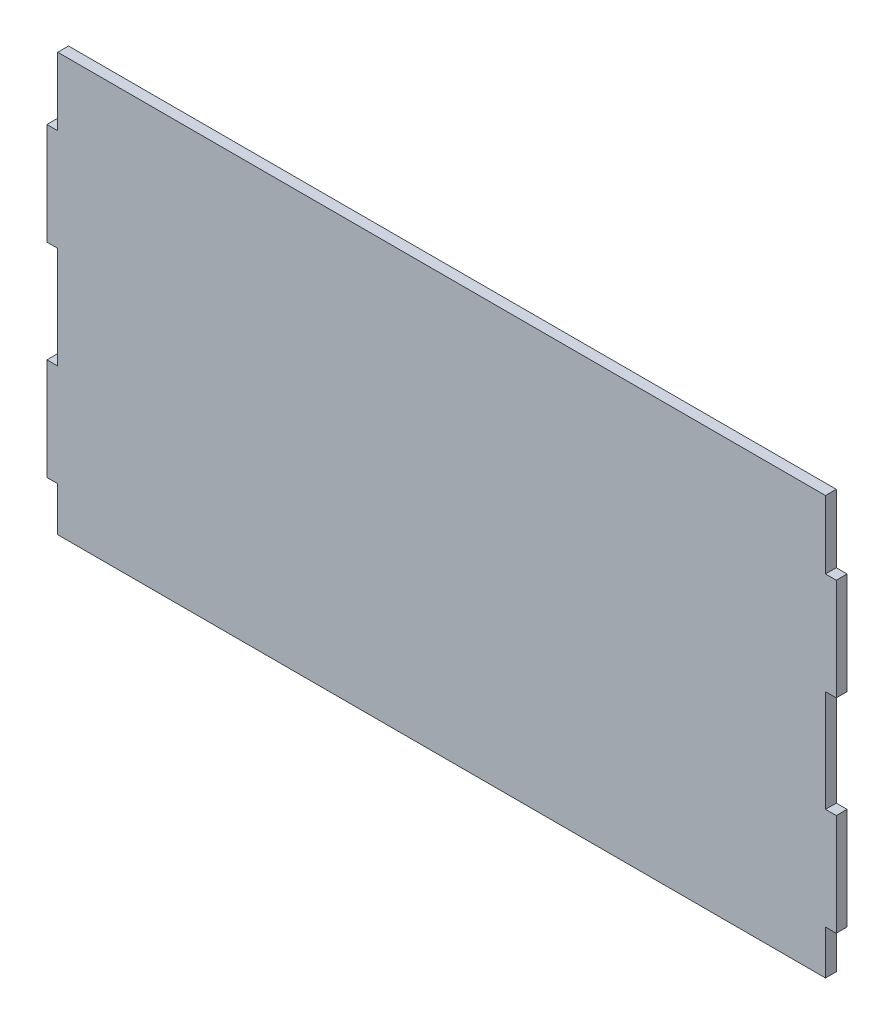
ISO-10303-21;
HEADER;
FILE_DESCRIPTION(('STEP AP214'),'2;1');
FILE_NAME('part.step','',(''),(''),'','','');
FILE_SCHEMA(('AUTOMOTIVE_DESIGN { 1 0 10303 214 1 1 1 1 }'));
ENDSEC;
DATA;
#1=APPLICATION_CONTEXT('core data for automotive mechanical design processes');
#2=APPLICATION_PROTOCOL_DEFINITION('international standard','automotive_design',2000,#1);
#3=PRODUCT_CONTEXT('',#1,'mechanical');
#4=PRODUCT('Part','Part','',(#3));
#5=PRODUCT_RELATED_PRODUCT_CATEGORY('part','',(#4));
#6=PRODUCT_DEFINITION_FORMATION('','',#4);
#7=PRODUCT_DEFINITION_CONTEXT('part definition',#1,'design');
#8=PRODUCT_DEFINITION('design','',#6,#7);
#9=PRODUCT_DEFINITION_SHAPE('','',#8);
#10=(LENGTH_UNIT() NAMED_UNIT(*) SI_UNIT(.MILLI.,.METRE.));
#11=(NAMED_UNIT(*) PLANE_ANGLE_UNIT() SI_UNIT($,.RADIAN.));
#12=(NAMED_UNIT(*) SI_UNIT($,.STERADIAN.) SOLID_ANGLE_UNIT());
#13=UNCERTAINTY_MEASURE_WITH_UNIT(LENGTH_MEASURE(1.E-05),#10,'distance_accuracy_value','');
#14=(GEOMETRIC_REPRESENTATION_CONTEXT(3) GLOBAL_UNCERTAINTY_ASSIGNED_CONTEXT((#13)) GLOBAL_UNIT_ASSIGNED_CONTEXT((#10,
#11,#12)) REPRESENTATION_CONTEXT('',''));
#15=CARTESIAN_POINT('',(0.,0.,0.));
#16=DIRECTION('',(0.,0.,1.));
#17=DIRECTION('',(1.,0.,0.));
#18=AXIS2_PLACEMENT_3D('',#15,#16,#17);
#19=CARTESIAN_POINT('',(226.,0.,3.175));
#20=DIRECTION('',(-1.,0.,0.));
#21=DIRECTION('',(0.,-1.,0.));
#22=AXIS2_PLACEMENT_3D('',#19,#20,#21);
#23=PLANE('',#22);
#24=DIRECTION('',(0.,1.,0.));
#25=VECTOR('',#24,1.);
#26=CARTESIAN_POINT('',(226.,0.,3.175));
#27=LINE('',#26,#25);
#28=CARTESIAN_POINT('',(226.,-80.,3.175));
#29=VERTEX_POINT('',#28);
#30=CARTESIAN_POINT('',(226.,-50.,3.175));
#31=VERTEX_POINT('',#30);
#32=EDGE_CURVE('E37',#29,#31,#27,.T.);
#33=ORIENTED_EDGE('',*,*,#32,.F.);
#34=DIRECTION('',(0.,0.,1.));
#35=VECTOR('',#34,1.);
#36=CARTESIAN_POINT('',(226.,-80.,-30.1675425747607));
#37=LINE('',#36,#35);
#38=CARTESIAN_POINT('',(226.,-80.,0.));
#39=VERTEX_POINT('',#38);
#40=EDGE_CURVE('E204',#39,#29,#37,.T.);
#41=ORIENTED_EDGE('',*,*,#40,.F.);
#42=DIRECTION('',(0.,1.,0.));
#43=VECTOR('',#42,1.);
#44=CARTESIAN_POINT('',(226.,0.,0.));
#45=LINE('',#44,#43);
#46=CARTESIAN_POINT('',(226.,-50.,0.));
#47=VERTEX_POINT('',#46);
#48=EDGE_CURVE('E336',#39,#47,#45,.T.);
#49=ORIENTED_EDGE('',*,*,#48,.T.);
#50=DIRECTION('',(0.,0.,1.));
#51=VECTOR('',#50,1.);
#52=CARTESIAN_POINT('',(226.,-50.,-30.1675425747607));
#53=LINE('',#52,#51);
#54=EDGE_CURVE('E256',#47,#31,#53,.T.);
#55=ORIENTED_EDGE('',*,*,#54,.T.);
#56=EDGE_LOOP('',(#33,#41,#49,#55));
#57=FACE_BOUND('',#56,.T.);
#58=ADVANCED_FACE('F33',(#57),#23,.F.);
#59=CARTESIAN_POINT('',(0.,0.,3.175));
#60=DIRECTION('',(1.,0.,0.));
#61=DIRECTION('',(0.,1.,0.));
#62=AXIS2_PLACEMENT_3D('',#59,#60,#61);
#63=PLANE('',#62);
#64=DIRECTION('',(0.,-1.,0.));
#65=VECTOR('',#64,1.);
#66=CARTESIAN_POINT('',(0.,0.,3.175));
#67=LINE('',#66,#65);
#68=CARTESIAN_POINT('',(0.,-110.,3.175));
#69=VERTEX_POINT('',#68);
#70=CARTESIAN_POINT('',(0.,-123.,3.175));
#71=VERTEX_POINT('',#70);
#72=EDGE_CURVE('E334',#69,#71,#67,.T.);
#73=ORIENTED_EDGE('',*,*,#72,.F.);
#74=DIRECTION('',(0.,0.,1.));
#75=VECTOR('',#74,1.);
#76=CARTESIAN_POINT('',(0.,-110.,-30.1675425747607));
#77=LINE('',#76,#75);
#78=CARTESIAN_POINT('',(0.,-110.,0.));
#79=VERTEX_POINT('',#78);
#80=EDGE_CURVE('E214',#79,#69,#77,.T.);
#81=ORIENTED_EDGE('',*,*,#80,.F.);
#82=DIRECTION('',(0.,-1.,0.));
#83=VECTOR('',#82,1.);
#84=CARTESIAN_POINT('',(0.,0.,0.));
#85=LINE('',#84,#83);
#86=CARTESIAN_POINT('',(0.,-123.,0.));
#87=VERTEX_POINT('',#86);
#88=EDGE_CURVE('E304',#79,#87,#85,.T.);
#89=ORIENTED_EDGE('',*,*,#88,.T.);
#90=DIRECTION('',(0.,0.,-1.));
#91=VECTOR('',#90,1.);
#92=CARTESIAN_POINT('',(0.,-123.,3.175));
#93=LINE('',#92,#91);
#94=EDGE_CURVE('E11',#71,#87,#93,.T.);
#95=ORIENTED_EDGE('',*,*,#94,.F.);
#96=EDGE_LOOP('',(#73,#81,#89,#95));
#97=FACE_BOUND('',#96,.T.);
#98=ADVANCED_FACE('F403',(#97),#63,.F.);
#99=DIRECTION('',(0.,0.,1.));
#100=VECTOR('',#99,1.);
#101=CARTESIAN_POINT('',(226.,-20.,-30.1675425747607));
#102=LINE('',#101,#100);
#103=CARTESIAN_POINT('',(226.,-20.,0.));
#104=VERTEX_POINT('',#103);
#105=CARTESIAN_POINT('',(226.,-20.,3.175));
#106=VERTEX_POINT('',#105);
#107=EDGE_CURVE('E239',#104,#106,#102,.T.);
#108=ORIENTED_EDGE('',*,*,#107,.F.);
#109=CARTESIAN_POINT('',(226.,0.,0.));
#110=VERTEX_POINT('',#109);
#111=EDGE_CURVE('E338',#104,#110,#45,.T.);
#112=ORIENTED_EDGE('',*,*,#111,.T.);
#113=DIRECTION('',(0.,0.,-1.));
#114=VECTOR('',#113,1.);
#115=CARTESIAN_POINT('',(226.,0.,3.175));
#116=LINE('',#115,#114);
#117=CARTESIAN_POINT('',(226.,0.,3.175));
#118=VERTEX_POINT('',#117);
#119=EDGE_CURVE('E359',#118,#110,#116,.T.);
#120=ORIENTED_EDGE('',*,*,#119,.F.);
#121=EDGE_CURVE('E252',#106,#118,#27,.T.);
#122=ORIENTED_EDGE('',*,*,#121,.F.);
#123=EDGE_LOOP('',(#108,#112,#120,#122));
#124=FACE_BOUND('',#123,.T.);
#125=ADVANCED_FACE('F371',(#124),#23,.F.);
#126=CARTESIAN_POINT('',(0.,-50.,0.));
#127=VERTEX_POINT('',#126);
#128=CARTESIAN_POINT('',(0.,-80.,0.));
#129=VERTEX_POINT('',#128);
#130=EDGE_CURVE('E320',#127,#129,#85,.T.);
#131=ORIENTED_EDGE('',*,*,#130,.T.);
#132=DIRECTION('',(0.,0.,1.));
#133=VECTOR('',#132,1.);
#134=CARTESIAN_POINT('',(0.,-80.,-30.1675425747607));
#135=LINE('',#134,#133);
#136=CARTESIAN_POINT('',(0.,-80.,3.175));
#137=VERTEX_POINT('',#136);
#138=EDGE_CURVE('E225',#129,#137,#135,.T.);
#139=ORIENTED_EDGE('',*,*,#138,.T.);
#140=CARTESIAN_POINT('',(0.,-50.,3.175));
#141=VERTEX_POINT('',#140);
#142=EDGE_CURVE('E290',#141,#137,#67,.T.);
#143=ORIENTED_EDGE('',*,*,#142,.F.);
#144=DIRECTION('',(0.,0.,1.));
#145=VECTOR('',#144,1.);
#146=CARTESIAN_POINT('',(0.,-50.,-30.1675425747607));
#147=LINE('',#146,#145);
#148=EDGE_CURVE('E277',#127,#141,#147,.T.);
#149=ORIENTED_EDGE('',*,*,#148,.F.);
#150=EDGE_LOOP('',(#131,#139,#143,#149));
#151=FACE_BOUND('',#150,.T.);
#152=ADVANCED_FACE('F410',(#151),#63,.F.);
#153=CARTESIAN_POINT('',(0.,0.,0.));
#154=VERTEX_POINT('',#153);
#155=CARTESIAN_POINT('',(0.,-20.,0.));
#156=VERTEX_POINT('',#155);
#157=EDGE_CURVE('E323',#154,#156,#85,.T.);
#158=ORIENTED_EDGE('',*,*,#157,.T.);
#159=DIRECTION('',(0.,0.,1.));
#160=VECTOR('',#159,1.);
#161=CARTESIAN_POINT('',(0.,-20.,-30.1675425747607));
#162=LINE('',#161,#160);
#163=CARTESIAN_POINT('',(0.,-20.,3.175));
#164=VERTEX_POINT('',#163);
#165=EDGE_CURVE('E295',#156,#164,#162,.T.);
#166=ORIENTED_EDGE('',*,*,#165,.T.);
#167=CARTESIAN_POINT('',(0.,0.,3.175));
#168=VERTEX_POINT('',#167);
#169=EDGE_CURVE('E318',#168,#164,#67,.T.);
#170=ORIENTED_EDGE('',*,*,#169,.F.);
#171=DIRECTION('',(0.,0.,-1.));
#172=VECTOR('',#171,1.);
#173=CARTESIAN_POINT('',(0.,0.,3.175));
#174=LINE('',#173,#172);
#175=EDGE_CURVE('E356',#168,#154,#174,.T.);
#176=ORIENTED_EDGE('',*,*,#175,.T.);
#177=EDGE_LOOP('',(#158,#166,#170,#176));
#178=FACE_BOUND('',#177,.T.);
#179=ADVANCED_FACE('F35',(#178),#63,.F.);
#180=CARTESIAN_POINT('',(0.,-123.,3.175));
#181=DIRECTION('',(0.,1.,0.));
#182=DIRECTION('',(0.,0.,1.));
#183=AXIS2_PLACEMENT_3D('',#180,#181,#182);
#184=PLANE('',#183);
#185=DIRECTION('',(1.,0.,0.));
#186=VECTOR('',#185,1.);
#187=CARTESIAN_POINT('',(0.,-123.,0.));
#188=LINE('',#187,#186);
#189=CARTESIAN_POINT('',(226.,-123.,0.));
#190=VERTEX_POINT('',#189);
#191=EDGE_CURVE('E328',#87,#190,#188,.T.);
#192=ORIENTED_EDGE('',*,*,#191,.T.);
#193=DIRECTION('',(0.,0.,-1.));
#194=VECTOR('',#193,1.);
#195=CARTESIAN_POINT('',(226.,-123.,3.175));
#196=LINE('',#195,#194);
#197=CARTESIAN_POINT('',(226.,-123.,3.175));
#198=VERTEX_POINT('',#197);
#199=EDGE_CURVE('E43',#198,#190,#196,.T.);
#200=ORIENTED_EDGE('',*,*,#199,.F.);
#201=DIRECTION('',(1.,0.,0.));
#202=VECTOR('',#201,1.);
#203=CARTESIAN_POINT('',(0.,-123.,3.175));
#204=LINE('',#203,#202);
#205=EDGE_CURVE('E314',#71,#198,#204,.T.);
#206=ORIENTED_EDGE('',*,*,#205,.F.);
#207=ORIENTED_EDGE('',*,*,#94,.T.);
#208=EDGE_LOOP('',(#192,#200,#206,#207));
#209=FACE_BOUND('',#208,.T.);
#210=ADVANCED_FACE('F414',(#209),#184,.F.);
#211=CARTESIAN_POINT('',(226.,-110.,0.));
#212=VERTEX_POINT('',#211);
#213=EDGE_CURVE('E337',#190,#212,#45,.T.);
#214=ORIENTED_EDGE('',*,*,#213,.T.);
#215=DIRECTION('',(0.,0.,1.));
#216=VECTOR('',#215,1.);
#217=CARTESIAN_POINT('',(226.,-110.,-30.1675425747607));
#218=LINE('',#217,#216);
#219=CARTESIAN_POINT('',(226.,-110.,3.175));
#220=VERTEX_POINT('',#219);
#221=EDGE_CURVE('E58',#212,#220,#218,.T.);
#222=ORIENTED_EDGE('',*,*,#221,.T.);
#223=EDGE_CURVE('E197',#198,#220,#27,.T.);
#224=ORIENTED_EDGE('',*,*,#223,.F.);
#225=ORIENTED_EDGE('',*,*,#199,.T.);
#226=EDGE_LOOP('',(#214,#222,#224,#225));
#227=FACE_BOUND('',#226,.T.);
#228=ADVANCED_FACE('F405',(#227),#23,.F.);
#229=CARTESIAN_POINT('',(0.,0.,3.175));
#230=DIRECTION('',(0.,-1.,0.));
#231=DIRECTION('',(0.,0.,-1.));
#232=AXIS2_PLACEMENT_3D('',#229,#230,#231);
#233=PLANE('',#232);
#234=DIRECTION('',(-1.,0.,0.));
#235=VECTOR('',#234,1.);
#236=CARTESIAN_POINT('',(0.,0.,0.));
#237=LINE('',#236,#235);
#238=EDGE_CURVE('E335',#110,#154,#237,.T.);
#239=ORIENTED_EDGE('',*,*,#238,.T.);
#240=ORIENTED_EDGE('',*,*,#175,.F.);
#241=DIRECTION('',(-1.,0.,0.));
#242=VECTOR('',#241,1.);
#243=CARTESIAN_POINT('',(0.,0.,3.175));
#244=LINE('',#243,#242);
#245=EDGE_CURVE('E327',#118,#168,#244,.T.);
#246=ORIENTED_EDGE('',*,*,#245,.F.);
#247=ORIENTED_EDGE('',*,*,#119,.T.);
#248=EDGE_LOOP('',(#239,#240,#246,#247));
#249=FACE_BOUND('',#248,.T.);
#250=ADVANCED_FACE('F354',(#249),#233,.F.);
#251=CARTESIAN_POINT('',(0.,0.,3.175));
#252=DIRECTION('',(0.,0.,1.));
#253=DIRECTION('',(1.,0.,0.));
#254=AXIS2_PLACEMENT_3D('',#251,#252,#253);
#255=PLANE('',#254);
#256=ORIENTED_EDGE('',*,*,#169,.T.);
#257=DIRECTION('',(-1.,0.,0.));
#258=VECTOR('',#257,1.);
#259=CARTESIAN_POINT('',(0.,-20.,3.175));
#260=LINE('',#259,#258);
#261=CARTESIAN_POINT('',(-3.175,-20.,3.175));
#262=VERTEX_POINT('',#261);
#263=EDGE_CURVE('E265',#164,#262,#260,.T.);
#264=ORIENTED_EDGE('',*,*,#263,.T.);
#265=DIRECTION('',(0.,-1.,0.));
#266=VECTOR('',#265,1.);
#267=CARTESIAN_POINT('',(-3.175,-20.,3.175));
#268=LINE('',#267,#266);
#269=CARTESIAN_POINT('',(-3.175,-50.,3.175));
#270=VERTEX_POINT('',#269);
#271=EDGE_CURVE('E278',#262,#270,#268,.T.);
#272=ORIENTED_EDGE('',*,*,#271,.T.);
#273=DIRECTION('',(1.,0.,0.));
#274=VECTOR('',#273,1.);
#275=CARTESIAN_POINT('',(0.,-50.,3.175));
#276=LINE('',#275,#274);
#277=EDGE_CURVE('E281',#270,#141,#276,.T.);
#278=ORIENTED_EDGE('',*,*,#277,.T.);
#279=ORIENTED_EDGE('',*,*,#142,.T.);
#280=DIRECTION('',(-1.,0.,0.));
#281=VECTOR('',#280,1.);
#282=CARTESIAN_POINT('',(0.,-80.,3.175));
#283=LINE('',#282,#281);
#284=CARTESIAN_POINT('',(-3.17499999999999,-80.,3.175));
#285=VERTEX_POINT('',#284);
#286=EDGE_CURVE('E210',#137,#285,#283,.T.);
#287=ORIENTED_EDGE('',*,*,#286,.T.);
#288=DIRECTION('',(0.,-1.,0.));
#289=VECTOR('',#288,1.);
#290=CARTESIAN_POINT('',(-3.17499999999999,-80.,3.175));
#291=LINE('',#290,#289);
#292=CARTESIAN_POINT('',(-3.17499999999999,-110.,3.175));
#293=VERTEX_POINT('',#292);
#294=EDGE_CURVE('E219',#285,#293,#291,.T.);
#295=ORIENTED_EDGE('',*,*,#294,.T.);
#296=DIRECTION('',(1.,0.,0.));
#297=VECTOR('',#296,1.);
#298=CARTESIAN_POINT('',(0.,-110.,3.175));
#299=LINE('',#298,#297);
#300=EDGE_CURVE('E222',#293,#69,#299,.T.);
#301=ORIENTED_EDGE('',*,*,#300,.T.);
#302=ORIENTED_EDGE('',*,*,#72,.T.);
#303=ORIENTED_EDGE('',*,*,#205,.T.);
#304=ORIENTED_EDGE('',*,*,#223,.T.);
#305=DIRECTION('',(1.,0.,0.));
#306=VECTOR('',#305,1.);
#307=CARTESIAN_POINT('',(226.,-110.,3.175));
#308=LINE('',#307,#306);
#309=CARTESIAN_POINT('',(229.175,-110.,3.175));
#310=VERTEX_POINT('',#309);
#311=EDGE_CURVE('E179',#220,#310,#308,.T.);
#312=ORIENTED_EDGE('',*,*,#311,.T.);
#313=DIRECTION('',(0.,1.,0.));
#314=VECTOR('',#313,1.);
#315=CARTESIAN_POINT('',(229.175,-80.,3.175));
#316=LINE('',#315,#314);
#317=CARTESIAN_POINT('',(229.175,-80.,3.175));
#318=VERTEX_POINT('',#317);
#319=EDGE_CURVE('E187',#310,#318,#316,.T.);
#320=ORIENTED_EDGE('',*,*,#319,.T.);
#321=DIRECTION('',(-1.,0.,0.));
#322=VECTOR('',#321,1.);
#323=CARTESIAN_POINT('',(226.,-80.,3.175));
#324=LINE('',#323,#322);
#325=EDGE_CURVE('E193',#318,#29,#324,.T.);
#326=ORIENTED_EDGE('',*,*,#325,.T.);
#327=ORIENTED_EDGE('',*,*,#32,.T.);
#328=DIRECTION('',(1.,0.,0.));
#329=VECTOR('',#328,1.);
#330=CARTESIAN_POINT('',(226.,-50.,3.175));
#331=LINE('',#330,#329);
#332=CARTESIAN_POINT('',(229.175,-50.,3.175));
#333=VERTEX_POINT('',#332);
#334=EDGE_CURVE('E235',#31,#333,#331,.T.);
#335=ORIENTED_EDGE('',*,*,#334,.T.);
#336=DIRECTION('',(0.,1.,0.));
#337=VECTOR('',#336,1.);
#338=CARTESIAN_POINT('',(229.175,-20.,3.175));
#339=LINE('',#338,#337);
#340=CARTESIAN_POINT('',(229.175,-20.,3.175));
#341=VERTEX_POINT('',#340);
#342=EDGE_CURVE('E240',#333,#341,#339,.T.);
#343=ORIENTED_EDGE('',*,*,#342,.T.);
#344=DIRECTION('',(-1.,0.,0.));
#345=VECTOR('',#344,1.);
#346=CARTESIAN_POINT('',(226.,-20.,3.175));
#347=LINE('',#346,#345);
#348=EDGE_CURVE('E243',#341,#106,#347,.T.);
#349=ORIENTED_EDGE('',*,*,#348,.T.);
#350=ORIENTED_EDGE('',*,*,#121,.T.);
#351=ORIENTED_EDGE('',*,*,#245,.T.);
#352=EDGE_LOOP('',(#256,#264,#272,#278,#279,#287,#295,#301,#302,#303,#304,#312,#320,#326,#327,
#335,#343,#349,#350,#351));
#353=FACE_BOUND('',#352,.T.);
#354=ADVANCED_FACE('F196',(#353),#255,.T.);
#355=CARTESIAN_POINT('',(0.,0.,0.));
#356=DIRECTION('',(0.,0.,1.));
#357=DIRECTION('',(1.,0.,0.));
#358=AXIS2_PLACEMENT_3D('',#355,#356,#357);
#359=PLANE('',#358);
#360=ORIENTED_EDGE('',*,*,#157,.F.);
#361=ORIENTED_EDGE('',*,*,#238,.F.);
#362=ORIENTED_EDGE('',*,*,#111,.F.);
#363=DIRECTION('',(1.,0.,0.));
#364=VECTOR('',#363,1.);
#365=CARTESIAN_POINT('',(226.,-20.,0.));
#366=LINE('',#365,#364);
#367=CARTESIAN_POINT('',(229.175,-20.,0.));
#368=VERTEX_POINT('',#367);
#369=EDGE_CURVE('E238',#104,#368,#366,.T.);
#370=ORIENTED_EDGE('',*,*,#369,.T.);
#371=DIRECTION('',(0.,-1.,0.));
#372=VECTOR('',#371,1.);
#373=CARTESIAN_POINT('',(229.175,-20.,0.));
#374=LINE('',#373,#372);
#375=CARTESIAN_POINT('',(229.175,-50.,0.));
#376=VERTEX_POINT('',#375);
#377=EDGE_CURVE('E236',#368,#376,#374,.T.);
#378=ORIENTED_EDGE('',*,*,#377,.T.);
#379=DIRECTION('',(-1.,0.,0.));
#380=VECTOR('',#379,1.);
#381=CARTESIAN_POINT('',(226.,-50.,0.));
#382=LINE('',#381,#380);
#383=EDGE_CURVE('E260',#376,#47,#382,.T.);
#384=ORIENTED_EDGE('',*,*,#383,.T.);
#385=ORIENTED_EDGE('',*,*,#48,.F.);
#386=DIRECTION('',(1.,0.,0.));
#387=VECTOR('',#386,1.);
#388=CARTESIAN_POINT('',(226.,-80.,0.));
#389=LINE('',#388,#387);
#390=CARTESIAN_POINT('',(229.175,-80.,0.));
#391=VERTEX_POINT('',#390);
#392=EDGE_CURVE('E200',#39,#391,#389,.T.);
#393=ORIENTED_EDGE('',*,*,#392,.T.);
#394=DIRECTION('',(0.,-1.,0.));
#395=VECTOR('',#394,1.);
#396=CARTESIAN_POINT('',(229.175,-80.,0.));
#397=LINE('',#396,#395);
#398=CARTESIAN_POINT('',(229.175,-110.,0.));
#399=VERTEX_POINT('',#398);
#400=EDGE_CURVE('E206',#391,#399,#397,.T.);
#401=ORIENTED_EDGE('',*,*,#400,.T.);
#402=DIRECTION('',(-1.,0.,0.));
#403=VECTOR('',#402,1.);
#404=CARTESIAN_POINT('',(226.,-110.,0.));
#405=LINE('',#404,#403);
#406=EDGE_CURVE('E181',#399,#212,#405,.T.);
#407=ORIENTED_EDGE('',*,*,#406,.T.);
#408=ORIENTED_EDGE('',*,*,#213,.F.);
#409=ORIENTED_EDGE('',*,*,#191,.F.);
#410=ORIENTED_EDGE('',*,*,#88,.F.);
#411=DIRECTION('',(-1.,0.,0.));
#412=VECTOR('',#411,1.);
#413=CARTESIAN_POINT('',(0.,-110.,0.));
#414=LINE('',#413,#412);
#415=CARTESIAN_POINT('',(-3.17499999999999,-110.,0.));
#416=VERTEX_POINT('',#415);
#417=EDGE_CURVE('E213',#79,#416,#414,.T.);
#418=ORIENTED_EDGE('',*,*,#417,.T.);
#419=DIRECTION('',(0.,1.,0.));
#420=VECTOR('',#419,1.);
#421=CARTESIAN_POINT('',(-3.17499999999999,-80.,0.));
#422=LINE('',#421,#420);
#423=CARTESIAN_POINT('',(-3.17499999999999,-80.,0.));
#424=VERTEX_POINT('',#423);
#425=EDGE_CURVE('E211',#416,#424,#422,.T.);
#426=ORIENTED_EDGE('',*,*,#425,.T.);
#427=DIRECTION('',(1.,0.,0.));
#428=VECTOR('',#427,1.);
#429=CARTESIAN_POINT('',(0.,-80.,0.));
#430=LINE('',#429,#428);
#431=EDGE_CURVE('E216',#424,#129,#430,.T.);
#432=ORIENTED_EDGE('',*,*,#431,.T.);
#433=ORIENTED_EDGE('',*,*,#130,.F.);
#434=DIRECTION('',(-1.,0.,0.));
#435=VECTOR('',#434,1.);
#436=CARTESIAN_POINT('',(0.,-50.,0.));
#437=LINE('',#436,#435);
#438=CARTESIAN_POINT('',(-3.175,-50.,0.));
#439=VERTEX_POINT('',#438);
#440=EDGE_CURVE('E276',#127,#439,#437,.T.);
#441=ORIENTED_EDGE('',*,*,#440,.T.);
#442=DIRECTION('',(0.,1.,0.));
#443=VECTOR('',#442,1.);
#444=CARTESIAN_POINT('',(-3.175,-20.,0.));
#445=LINE('',#444,#443);
#446=CARTESIAN_POINT('',(-3.175,-20.,0.));
#447=VERTEX_POINT('',#446);
#448=EDGE_CURVE('E274',#439,#447,#445,.T.);
#449=ORIENTED_EDGE('',*,*,#448,.T.);
#450=DIRECTION('',(1.,0.,0.));
#451=VECTOR('',#450,1.);
#452=CARTESIAN_POINT('',(0.,-20.,0.));
#453=LINE('',#452,#451);
#454=EDGE_CURVE('E299',#447,#156,#453,.T.);
#455=ORIENTED_EDGE('',*,*,#454,.T.);
#456=EDGE_LOOP('',(#360,#361,#362,#370,#378,#384,#385,#393,#401,#407,#408,#409,#410,#418,#426,
#432,#433,#441,#449,#455));
#457=FACE_BOUND('',#456,.T.);
#458=ADVANCED_FACE('F364',(#457),#359,.F.);
#459=CARTESIAN_POINT('',(0.,-50.,-30.1675425747607));
#460=DIRECTION('',(0.,-1.,0.));
#461=DIRECTION('',(0.,0.,-1.));
#462=AXIS2_PLACEMENT_3D('',#459,#460,#461);
#463=PLANE('',#462);
#464=ORIENTED_EDGE('',*,*,#440,.F.);
#465=ORIENTED_EDGE('',*,*,#148,.T.);
#466=ORIENTED_EDGE('',*,*,#277,.F.);
#467=DIRECTION('',(0.,0.,1.));
#468=VECTOR('',#467,1.);
#469=CARTESIAN_POINT('',(-3.175,-50.,-30.1675425747607));
#470=LINE('',#469,#468);
#471=EDGE_CURVE('E284',#439,#270,#470,.T.);
#472=ORIENTED_EDGE('',*,*,#471,.F.);
#473=EDGE_LOOP('',(#464,#465,#466,#472));
#474=FACE_BOUND('',#473,.T.);
#475=ADVANCED_FACE('F440',(#474),#463,.T.);
#476=CARTESIAN_POINT('',(-3.175,-20.,-30.1675425747607));
#477=DIRECTION('',(-1.,0.,0.));
#478=DIRECTION('',(0.,-1.,0.));
#479=AXIS2_PLACEMENT_3D('',#476,#477,#478);
#480=PLANE('',#479);
#481=ORIENTED_EDGE('',*,*,#448,.F.);
#482=ORIENTED_EDGE('',*,*,#471,.T.);
#483=ORIENTED_EDGE('',*,*,#271,.F.);
#484=DIRECTION('',(0.,0.,1.));
#485=VECTOR('',#484,1.);
#486=CARTESIAN_POINT('',(-3.175,-20.,-30.1675425747607));
#487=LINE('',#486,#485);
#488=EDGE_CURVE('E309',#447,#262,#487,.T.);
#489=ORIENTED_EDGE('',*,*,#488,.F.);
#490=EDGE_LOOP('',(#481,#482,#483,#489));
#491=FACE_BOUND('',#490,.T.);
#492=ADVANCED_FACE('F445',(#491),#480,.T.);
#493=CARTESIAN_POINT('',(0.,-20.,-30.1675425747607));
#494=DIRECTION('',(0.,1.,0.));
#495=DIRECTION('',(-1.,0.,0.));
#496=AXIS2_PLACEMENT_3D('',#493,#494,#495);
#497=PLANE('',#496);
#498=ORIENTED_EDGE('',*,*,#454,.F.);
#499=ORIENTED_EDGE('',*,*,#488,.T.);
#500=ORIENTED_EDGE('',*,*,#263,.F.);
#501=ORIENTED_EDGE('',*,*,#165,.F.);
#502=EDGE_LOOP('',(#498,#499,#500,#501));
#503=FACE_BOUND('',#502,.T.);
#504=ADVANCED_FACE('F450',(#503),#497,.T.);
#505=CARTESIAN_POINT('',(226.,-20.,-30.1675425747607));
#506=DIRECTION('',(0.,1.,0.));
#507=DIRECTION('',(0.,0.,1.));
#508=AXIS2_PLACEMENT_3D('',#505,#506,#507);
#509=PLANE('',#508);
#510=ORIENTED_EDGE('',*,*,#369,.F.);
#511=ORIENTED_EDGE('',*,*,#107,.T.);
#512=ORIENTED_EDGE('',*,*,#348,.F.);
#513=DIRECTION('',(0.,0.,1.));
#514=VECTOR('',#513,1.);
#515=CARTESIAN_POINT('',(229.175,-20.,-30.1675425747607));
#516=LINE('',#515,#514);
#517=EDGE_CURVE('E246',#368,#341,#516,.T.);
#518=ORIENTED_EDGE('',*,*,#517,.F.);
#519=EDGE_LOOP('',(#510,#511,#512,#518));
#520=FACE_BOUND('',#519,.T.);
#521=ADVANCED_FACE('F376',(#520),#509,.T.);
#522=CARTESIAN_POINT('',(229.175,-20.,-30.1675425747607));
#523=DIRECTION('',(1.,0.,0.));
#524=DIRECTION('',(0.,0.,-1.));
#525=AXIS2_PLACEMENT_3D('',#522,#523,#524);
#526=PLANE('',#525);
#527=ORIENTED_EDGE('',*,*,#377,.F.);
#528=ORIENTED_EDGE('',*,*,#517,.T.);
#529=ORIENTED_EDGE('',*,*,#342,.F.);
#530=DIRECTION('',(0.,0.,1.));
#531=VECTOR('',#530,1.);
#532=CARTESIAN_POINT('',(229.175,-50.,-30.1675425747607));
#533=LINE('',#532,#531);
#534=EDGE_CURVE('E270',#376,#333,#533,.T.);
#535=ORIENTED_EDGE('',*,*,#534,.F.);
#536=EDGE_LOOP('',(#527,#528,#529,#535));
#537=FACE_BOUND('',#536,.T.);
#538=ADVANCED_FACE('F387',(#537),#526,.T.);
#539=CARTESIAN_POINT('',(226.,-50.,-30.1675425747607));
#540=DIRECTION('',(0.,-1.,0.));
#541=DIRECTION('',(0.,0.,-1.));
#542=AXIS2_PLACEMENT_3D('',#539,#540,#541);
#543=PLANE('',#542);
#544=ORIENTED_EDGE('',*,*,#383,.F.);
#545=ORIENTED_EDGE('',*,*,#534,.T.);
#546=ORIENTED_EDGE('',*,*,#334,.F.);
#547=ORIENTED_EDGE('',*,*,#54,.F.);
#548=EDGE_LOOP('',(#544,#545,#546,#547));
#549=FACE_BOUND('',#548,.T.);
#550=ADVANCED_FACE('F384',(#549),#543,.T.);
#551=CARTESIAN_POINT('',(0.,-110.,-30.1675425747607));
#552=DIRECTION('',(0.,-1.,0.));
#553=DIRECTION('',(1.,0.,0.));
#554=AXIS2_PLACEMENT_3D('',#551,#552,#553);
#555=PLANE('',#554);
#556=ORIENTED_EDGE('',*,*,#417,.F.);
#557=ORIENTED_EDGE('',*,*,#80,.T.);
#558=ORIENTED_EDGE('',*,*,#300,.F.);
#559=DIRECTION('',(0.,0.,1.));
#560=VECTOR('',#559,1.);
#561=CARTESIAN_POINT('',(-3.17499999999999,-110.,-30.1675425747607));
#562=LINE('',#561,#560);
#563=EDGE_CURVE('E228',#416,#293,#562,.T.);
#564=ORIENTED_EDGE('',*,*,#563,.F.);
#565=EDGE_LOOP('',(#556,#557,#558,#564));
#566=FACE_BOUND('',#565,.T.);
#567=ADVANCED_FACE('F462',(#566),#555,.T.);
#568=CARTESIAN_POINT('',(-3.17499999999999,-80.,-30.1675425747607));
#569=DIRECTION('',(-1.,0.,0.));
#570=DIRECTION('',(0.,-1.,0.));
#571=AXIS2_PLACEMENT_3D('',#568,#569,#570);
#572=PLANE('',#571);
#573=ORIENTED_EDGE('',*,*,#425,.F.);
#574=ORIENTED_EDGE('',*,*,#563,.T.);
#575=ORIENTED_EDGE('',*,*,#294,.F.);
#576=DIRECTION('',(0.,0.,1.));
#577=VECTOR('',#576,1.);
#578=CARTESIAN_POINT('',(-3.17499999999999,-80.,-30.1675425747607));
#579=LINE('',#578,#577);
#580=EDGE_CURVE('E230',#424,#285,#579,.T.);
#581=ORIENTED_EDGE('',*,*,#580,.F.);
#582=EDGE_LOOP('',(#573,#574,#575,#581));
#583=FACE_BOUND('',#582,.T.);
#584=ADVANCED_FACE('F399',(#583),#572,.T.);
#585=CARTESIAN_POINT('',(0.,-80.,-30.1675425747607));
#586=DIRECTION('',(0.,1.,0.));
#587=DIRECTION('',(-1.,0.,0.));
#588=AXIS2_PLACEMENT_3D('',#585,#586,#587);
#589=PLANE('',#588);
#590=ORIENTED_EDGE('',*,*,#431,.F.);
#591=ORIENTED_EDGE('',*,*,#580,.T.);
#592=ORIENTED_EDGE('',*,*,#286,.F.);
#593=ORIENTED_EDGE('',*,*,#138,.F.);
#594=EDGE_LOOP('',(#590,#591,#592,#593));
#595=FACE_BOUND('',#594,.T.);
#596=ADVANCED_FACE('F392',(#595),#589,.T.);
#597=CARTESIAN_POINT('',(226.,-80.,-30.1675425747607));
#598=DIRECTION('',(0.,1.,0.));
#599=DIRECTION('',(0.,0.,1.));
#600=AXIS2_PLACEMENT_3D('',#597,#598,#599);
#601=PLANE('',#600);
#602=ORIENTED_EDGE('',*,*,#392,.F.);
#603=ORIENTED_EDGE('',*,*,#40,.T.);
#604=ORIENTED_EDGE('',*,*,#325,.F.);
#605=DIRECTION('',(0.,0.,1.));
#606=VECTOR('',#605,1.);
#607=CARTESIAN_POINT('',(229.175,-80.,-30.1675425747607));
#608=LINE('',#607,#606);
#609=EDGE_CURVE('E184',#391,#318,#608,.T.);
#610=ORIENTED_EDGE('',*,*,#609,.F.);
#611=EDGE_LOOP('',(#602,#603,#604,#610));
#612=FACE_BOUND('',#611,.T.);
#613=ADVANCED_FACE('F390',(#612),#601,.T.);
#614=CARTESIAN_POINT('',(229.175,-80.,-30.1675425747607));
#615=DIRECTION('',(1.,0.,0.));
#616=DIRECTION('',(0.,0.,-1.));
#617=AXIS2_PLACEMENT_3D('',#614,#615,#616);
#618=PLANE('',#617);
#619=ORIENTED_EDGE('',*,*,#400,.F.);
#620=ORIENTED_EDGE('',*,*,#609,.T.);
#621=ORIENTED_EDGE('',*,*,#319,.F.);
#622=DIRECTION('',(0.,0.,1.));
#623=VECTOR('',#622,1.);
#624=CARTESIAN_POINT('',(229.175,-110.,-30.1675425747607));
#625=LINE('',#624,#623);
#626=EDGE_CURVE('E175',#399,#310,#625,.T.);
#627=ORIENTED_EDGE('',*,*,#626,.F.);
#628=EDGE_LOOP('',(#619,#620,#621,#627));
#629=FACE_BOUND('',#628,.T.);
#630=ADVANCED_FACE('F188',(#629),#618,.T.);
#631=CARTESIAN_POINT('',(226.,-110.,-30.1675425747607));
#632=DIRECTION('',(0.,-1.,0.));
#633=DIRECTION('',(0.,0.,-1.));
#634=AXIS2_PLACEMENT_3D('',#631,#632,#633);
#635=PLANE('',#634);
#636=ORIENTED_EDGE('',*,*,#406,.F.);
#637=ORIENTED_EDGE('',*,*,#626,.T.);
#638=ORIENTED_EDGE('',*,*,#311,.F.);
#639=ORIENTED_EDGE('',*,*,#221,.F.);
#640=EDGE_LOOP('',(#636,#637,#638,#639));
#641=FACE_BOUND('',#640,.T.);
#642=ADVANCED_FACE('F177',(#641),#635,.T.);
#643=CLOSED_SHELL('',(#58,#98,#125,#152,#179,#210,#228,#250,#354,#458,#475,#492,#504,#521,#538,
#550,#567,#584,#596,#613,#630,#642));
#644=MANIFOLD_SOLID_BREP('B2',#643);
#645=ADVANCED_BREP_SHAPE_REPRESENTATION('',(#18,#644),#14);
#646=SHAPE_DEFINITION_REPRESENTATION(#9,#645);
ENDSEC;
END-ISO-10303-21;
